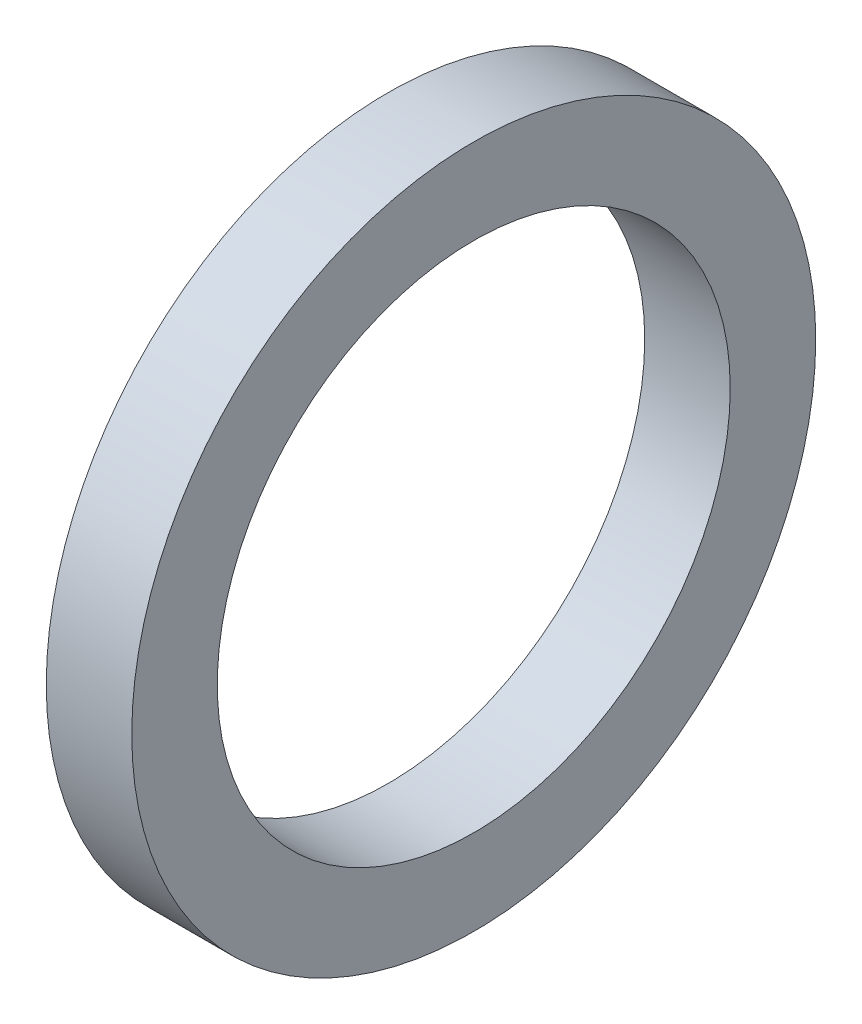
ISO-10303-21;
HEADER;
FILE_DESCRIPTION(('STEP AP214'),'2;1');
FILE_NAME('part.step','',(''),(''),'','','');
FILE_SCHEMA(('AUTOMOTIVE_DESIGN { 1 0 10303 214 1 1 1 1 }'));
ENDSEC;
DATA;
#1=APPLICATION_CONTEXT('core data for automotive mechanical design processes');
#2=APPLICATION_PROTOCOL_DEFINITION('international standard','automotive_design',2000,#1);
#3=PRODUCT_CONTEXT('',#1,'mechanical');
#4=PRODUCT('Part','Part','',(#3));
#5=PRODUCT_RELATED_PRODUCT_CATEGORY('part','',(#4));
#6=PRODUCT_DEFINITION_FORMATION('','',#4);
#7=PRODUCT_DEFINITION_CONTEXT('part definition',#1,'design');
#8=PRODUCT_DEFINITION('design','',#6,#7);
#9=PRODUCT_DEFINITION_SHAPE('','',#8);
#10=(LENGTH_UNIT() NAMED_UNIT(*) SI_UNIT(.MILLI.,.METRE.));
#11=(NAMED_UNIT(*) PLANE_ANGLE_UNIT() SI_UNIT($,.RADIAN.));
#12=(NAMED_UNIT(*) SI_UNIT($,.STERADIAN.) SOLID_ANGLE_UNIT());
#13=UNCERTAINTY_MEASURE_WITH_UNIT(LENGTH_MEASURE(1.E-05),#10,'distance_accuracy_value','');
#14=(GEOMETRIC_REPRESENTATION_CONTEXT(3) GLOBAL_UNCERTAINTY_ASSIGNED_CONTEXT((#13)) GLOBAL_UNIT_ASSIGNED_CONTEXT((#10,
#11,#12)) REPRESENTATION_CONTEXT('',''));
#15=CARTESIAN_POINT('',(0.,0.,0.));
#16=DIRECTION('',(0.,0.,1.));
#17=DIRECTION('',(1.,0.,0.));
#18=AXIS2_PLACEMENT_3D('',#15,#16,#17);
#19=CARTESIAN_POINT('',(2.,-8.09600000000001,8.096));
#20=DIRECTION('',(1.,0.,0.));
#21=DIRECTION('',(0.,0.,-1.));
#22=AXIS2_PLACEMENT_3D('',#19,#20,#21);
#23=PLANE('',#22);
#24=CARTESIAN_POINT('',(2.,0.,0.));
#25=DIRECTION('',(1.,0.,0.));
#26=DIRECTION('',(0.,0.,-1.));
#27=AXIS2_PLACEMENT_3D('',#24,#25,#26);
#28=CIRCLE('',#27,6.);
#29=CARTESIAN_POINT('',(2.,0.,-6.));
#30=VERTEX_POINT('',#29);
#31=EDGE_CURVE('E27',#30,#30,#28,.T.);
#32=ORIENTED_EDGE('',*,*,#31,.F.);
#33=EDGE_LOOP('',(#32));
#34=FACE_BOUND('',#33,.T.);
#35=CARTESIAN_POINT('',(2.,0.,0.));
#36=DIRECTION('',(1.,0.,0.));
#37=DIRECTION('',(0.,0.,-1.));
#38=AXIS2_PLACEMENT_3D('',#35,#36,#37);
#39=CIRCLE('',#38,8.);
#40=CARTESIAN_POINT('',(2.,0.,-8.));
#41=VERTEX_POINT('',#40);
#42=EDGE_CURVE('E18',#41,#41,#39,.F.);
#43=ORIENTED_EDGE('',*,*,#42,.F.);
#44=EDGE_LOOP('',(#43));
#45=FACE_BOUND('',#44,.T.);
#46=ADVANCED_FACE('F15',(#34,#45),#23,.T.);
#47=CARTESIAN_POINT('',(2.,0.,0.));
#48=DIRECTION('',(1.,0.,0.));
#49=DIRECTION('',(0.,0.,-1.));
#50=AXIS2_PLACEMENT_3D('',#47,#48,#49);
#51=CYLINDRICAL_SURFACE('',#50,8.);
#52=ORIENTED_EDGE('',*,*,#42,.T.);
#53=EDGE_LOOP('',(#52));
#54=FACE_BOUND('',#53,.T.);
#55=CARTESIAN_POINT('',(0.,0.,0.));
#56=DIRECTION('',(1.,0.,0.));
#57=DIRECTION('',(0.,0.,-1.));
#58=AXIS2_PLACEMENT_3D('',#55,#56,#57);
#59=CIRCLE('',#58,8.);
#60=CARTESIAN_POINT('',(0.,0.,-8.));
#61=VERTEX_POINT('',#60);
#62=EDGE_CURVE('E22',#61,#61,#59,.F.);
#63=ORIENTED_EDGE('',*,*,#62,.F.);
#64=EDGE_LOOP('',(#63));
#65=FACE_BOUND('',#64,.T.);
#66=ADVANCED_FACE('F35',(#54,#65),#51,.T.);
#67=CARTESIAN_POINT('',(0.,0.,0.));
#68=DIRECTION('',(1.,0.,0.));
#69=DIRECTION('',(0.,0.,-1.));
#70=AXIS2_PLACEMENT_3D('',#67,#68,#69);
#71=CYLINDRICAL_SURFACE('',#70,6.);
#72=ORIENTED_EDGE('',*,*,#31,.T.);
#73=EDGE_LOOP('',(#72));
#74=FACE_BOUND('',#73,.T.);
#75=CARTESIAN_POINT('',(0.,0.,0.));
#76=DIRECTION('',(1.,0.,0.));
#77=DIRECTION('',(0.,0.,-1.));
#78=AXIS2_PLACEMENT_3D('',#75,#76,#77);
#79=CIRCLE('',#78,6.);
#80=CARTESIAN_POINT('',(0.,0.,-6.));
#81=VERTEX_POINT('',#80);
#82=EDGE_CURVE('E10',#81,#81,#79,.T.);
#83=ORIENTED_EDGE('',*,*,#82,.F.);
#84=EDGE_LOOP('',(#83));
#85=FACE_BOUND('',#84,.T.);
#86=ADVANCED_FACE('F44',(#74,#85),#71,.F.);
#87=CARTESIAN_POINT('',(0.,-8.09600000000001,-8.096));
#88=DIRECTION('',(-1.,0.,0.));
#89=DIRECTION('',(0.,0.,1.));
#90=AXIS2_PLACEMENT_3D('',#87,#88,#89);
#91=PLANE('',#90);
#92=ORIENTED_EDGE('',*,*,#82,.T.);
#93=EDGE_LOOP('',(#92));
#94=FACE_BOUND('',#93,.T.);
#95=ORIENTED_EDGE('',*,*,#62,.T.);
#96=EDGE_LOOP('',(#95));
#97=FACE_BOUND('',#96,.T.);
#98=ADVANCED_FACE('F45',(#94,#97),#91,.T.);
#99=CLOSED_SHELL('',(#46,#66,#86,#98));
#100=MANIFOLD_SOLID_BREP('B1',#99);
#101=ADVANCED_BREP_SHAPE_REPRESENTATION('',(#18,#100),#14);
#102=SHAPE_DEFINITION_REPRESENTATION(#9,#101);
ENDSEC;
END-ISO-10303-21;
